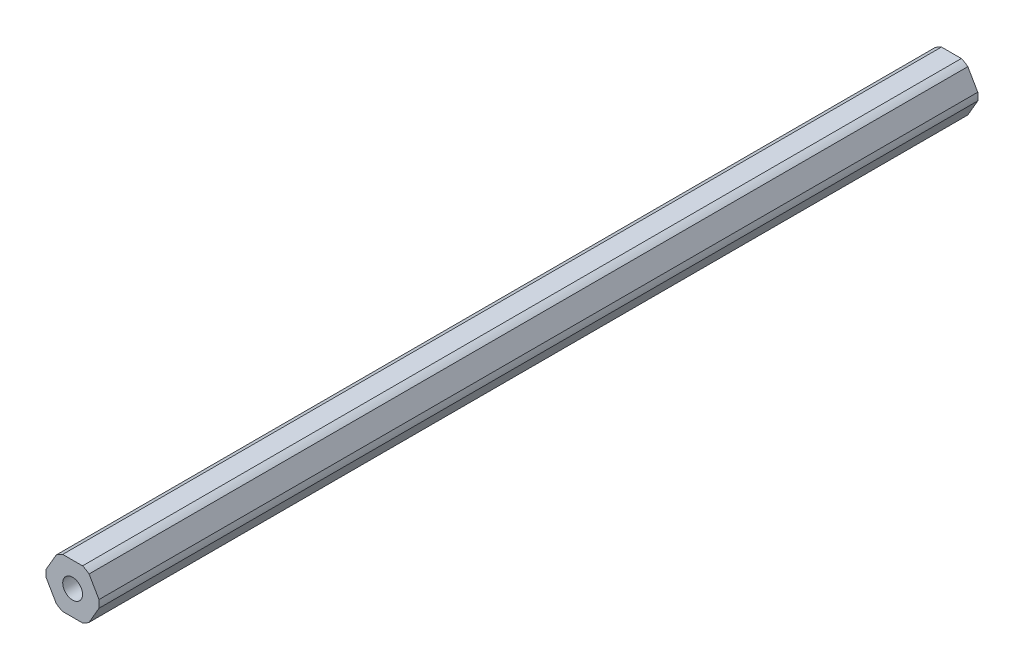
ISO-10303-21;
HEADER;
FILE_DESCRIPTION(('STEP AP214'),'2;1');
FILE_NAME('part.step','',(''),(''),'','','');
FILE_SCHEMA(('AUTOMOTIVE_DESIGN { 1 0 10303 214 1 1 1 1 }'));
ENDSEC;
DATA;
#1=APPLICATION_CONTEXT('core data for automotive mechanical design processes');
#2=APPLICATION_PROTOCOL_DEFINITION('international standard','automotive_design',2000,#1);
#3=PRODUCT_CONTEXT('',#1,'mechanical');
#4=PRODUCT('Part','Part','',(#3));
#5=PRODUCT_RELATED_PRODUCT_CATEGORY('part','',(#4));
#6=PRODUCT_DEFINITION_FORMATION('','',#4);
#7=PRODUCT_DEFINITION_CONTEXT('part definition',#1,'design');
#8=PRODUCT_DEFINITION('design','',#6,#7);
#9=PRODUCT_DEFINITION_SHAPE('','',#8);
#10=(LENGTH_UNIT() NAMED_UNIT(*) SI_UNIT(.MILLI.,.METRE.));
#11=(NAMED_UNIT(*) PLANE_ANGLE_UNIT() SI_UNIT($,.RADIAN.));
#12=(NAMED_UNIT(*) SI_UNIT($,.STERADIAN.) SOLID_ANGLE_UNIT());
#13=UNCERTAINTY_MEASURE_WITH_UNIT(LENGTH_MEASURE(1.E-05),#10,'distance_accuracy_value','');
#14=(GEOMETRIC_REPRESENTATION_CONTEXT(3) GLOBAL_UNCERTAINTY_ASSIGNED_CONTEXT((#13)) GLOBAL_UNIT_ASSIGNED_CONTEXT((#10,
#11,#12)) REPRESENTATION_CONTEXT('',''));
#15=CARTESIAN_POINT('',(0.,0.,0.));
#16=DIRECTION('',(0.,0.,1.));
#17=DIRECTION('',(1.,0.,0.));
#18=AXIS2_PLACEMENT_3D('',#15,#16,#17);
#19=CARTESIAN_POINT('',(0.,0.,-457.2));
#20=DIRECTION('',(0.,0.,1.));
#21=DIRECTION('',(1.,0.,0.));
#22=AXIS2_PLACEMENT_3D('',#19,#20,#21);
#23=CYLINDRICAL_SURFACE('',#22,6.87);
#24=CARTESIAN_POINT('',(0.,0.,230.63200000001));
#25=DIRECTION('',(0.,0.,1.));
#26=DIRECTION('',(1.,0.,0.));
#27=AXIS2_PLACEMENT_3D('',#24,#25,#26);
#28=CIRCLE('',#27,6.87);
#29=CARTESIAN_POINT('',(6.80102150534208,0.97108520937895,230.63200000001));
#30=VERTEX_POINT('',#29);
#31=CARTESIAN_POINT('',(6.80102150534208,-0.971085209378955,230.63200000001));
#32=VERTEX_POINT('',#31);
#33=EDGE_CURVE('E201',#30,#32,#28,.F.);
#34=ORIENTED_EDGE('',*,*,#33,.F.);
#35=DIRECTION('',(0.,0.,1.));
#36=VECTOR('',#35,1.);
#37=CARTESIAN_POINT('',(6.80102150534208,0.97108520937895,457.2));
#38=LINE('',#37,#36);
#39=CARTESIAN_POINT('',(6.80102150534208,0.971085209378948,457.2));
#40=VERTEX_POINT('',#39);
#41=EDGE_CURVE('E181',#30,#40,#38,.T.);
#42=ORIENTED_EDGE('',*,*,#41,.T.);
#43=CARTESIAN_POINT('',(0.,0.,457.2));
#44=DIRECTION('',(0.,0.,1.));
#45=DIRECTION('',(1.,0.,0.));
#46=AXIS2_PLACEMENT_3D('',#43,#44,#45);
#47=CIRCLE('',#46,6.87);
#48=CARTESIAN_POINT('',(6.80102150534208,-0.971085209378954,457.2));
#49=VERTEX_POINT('',#48);
#50=EDGE_CURVE('E230',#40,#49,#47,.F.);
#51=ORIENTED_EDGE('',*,*,#50,.T.);
#52=DIRECTION('',(0.,0.,1.));
#53=VECTOR('',#52,1.);
#54=CARTESIAN_POINT('',(6.80102150534208,-0.971085209378955,457.2));
#55=LINE('',#54,#53);
#56=EDGE_CURVE('E260',#49,#32,#55,.F.);
#57=ORIENTED_EDGE('',*,*,#56,.T.);
#58=EDGE_LOOP('',(#34,#42,#51,#57));
#59=FACE_BOUND('',#58,.T.);
#60=ADVANCED_FACE('F53',(#59),#23,.T.);
#61=CARTESIAN_POINT('',(3.68083890619154,6.3754,457.2));
#62=DIRECTION('',(0.,-1.,0.));
#63=DIRECTION('',(1.,0.,0.));
#64=AXIS2_PLACEMENT_3D('',#61,#62,#63);
#65=PLANE('',#64);
#66=DIRECTION('',(0.,0.,1.));
#67=VECTOR('',#66,1.);
#68=CARTESIAN_POINT('',(2.55952629210953,6.37540000000001,-457.2));
#69=LINE('',#68,#67);
#70=CARTESIAN_POINT('',(2.55952629210953,6.37540000000001,230.63200000001));
#71=VERTEX_POINT('',#70);
#72=CARTESIAN_POINT('',(2.55952629210953,6.37540000000001,457.2));
#73=VERTEX_POINT('',#72);
#74=EDGE_CURVE('E180',#71,#73,#69,.T.);
#75=ORIENTED_EDGE('',*,*,#74,.F.);
#76=DIRECTION('',(-1.,0.,0.));
#77=VECTOR('',#76,1.);
#78=CARTESIAN_POINT('',(3.68083890619154,6.3754,230.63200000001));
#79=LINE('',#78,#77);
#80=CARTESIAN_POINT('',(-2.55952629210953,6.37540000000001,230.63200000001));
#81=VERTEX_POINT('',#80);
#82=EDGE_CURVE('E73',#71,#81,#79,.T.);
#83=ORIENTED_EDGE('',*,*,#82,.T.);
#84=DIRECTION('',(0.,0.,1.));
#85=VECTOR('',#84,1.);
#86=CARTESIAN_POINT('',(-2.55952629210953,6.37540000000001,-457.2));
#87=LINE('',#86,#85);
#88=CARTESIAN_POINT('',(-2.55952629210953,6.37540000000001,457.2));
#89=VERTEX_POINT('',#88);
#90=EDGE_CURVE('E285',#89,#81,#87,.F.);
#91=ORIENTED_EDGE('',*,*,#90,.F.);
#92=DIRECTION('',(1.,0.,0.));
#93=VECTOR('',#92,1.);
#94=CARTESIAN_POINT('',(0.,6.3754,457.2));
#95=LINE('',#94,#93);
#96=EDGE_CURVE('E247',#73,#89,#95,.F.);
#97=ORIENTED_EDGE('',*,*,#96,.F.);
#98=EDGE_LOOP('',(#75,#83,#91,#97));
#99=FACE_BOUND('',#98,.T.);
#100=ADVANCED_FACE('F341',(#99),#65,.F.);
#101=CARTESIAN_POINT('',(0.,0.,-457.2));
#102=DIRECTION('',(0.,0.,1.));
#103=DIRECTION('',(1.,0.,0.));
#104=AXIS2_PLACEMENT_3D('',#101,#102,#103);
#105=CYLINDRICAL_SURFACE('',#104,6.87);
#106=CARTESIAN_POINT('',(0.,0.,230.63200000001));
#107=DIRECTION('',(0.,0.,1.));
#108=DIRECTION('',(1.,0.,0.));
#109=AXIS2_PLACEMENT_3D('',#106,#107,#108);
#110=CIRCLE('',#109,6.87);
#111=CARTESIAN_POINT('',(-4.24149521323255,5.40431479062104,230.63200000001));
#112=VERTEX_POINT('',#111);
#113=EDGE_CURVE('E81',#112,#81,#110,.F.);
#114=ORIENTED_EDGE('',*,*,#113,.F.);
#115=DIRECTION('',(0.,0.,1.));
#116=VECTOR('',#115,1.);
#117=CARTESIAN_POINT('',(-4.24149521323255,5.40431479062104,457.2));
#118=LINE('',#117,#116);
#119=CARTESIAN_POINT('',(-4.24149521323255,5.40431479062105,457.2));
#120=VERTEX_POINT('',#119);
#121=EDGE_CURVE('E282',#112,#120,#118,.T.);
#122=ORIENTED_EDGE('',*,*,#121,.T.);
#123=CARTESIAN_POINT('',(0.,0.,457.2));
#124=DIRECTION('',(0.,0.,1.));
#125=DIRECTION('',(1.,0.,0.));
#126=AXIS2_PLACEMENT_3D('',#123,#124,#125);
#127=CIRCLE('',#126,6.87);
#128=EDGE_CURVE('E246',#89,#120,#127,.T.);
#129=ORIENTED_EDGE('',*,*,#128,.F.);
#130=ORIENTED_EDGE('',*,*,#90,.T.);
#131=EDGE_LOOP('',(#114,#122,#129,#130));
#132=FACE_BOUND('',#131,.T.);
#133=ADVANCED_FACE('F339',(#132),#105,.T.);
#134=CARTESIAN_POINT('',(-3.68083890619154,6.3754,457.2));
#135=DIRECTION('',(0.866025403784439,-0.5,0.));
#136=DIRECTION('',(0.5,0.866025403784439,0.));
#137=AXIS2_PLACEMENT_3D('',#134,#135,#136);
#138=PLANE('',#137);
#139=ORIENTED_EDGE('',*,*,#121,.F.);
#140=DIRECTION('',(-0.5,-0.866025403784439,0.));
#141=VECTOR('',#140,1.);
#142=CARTESIAN_POINT('',(-3.68083890619154,6.3754,230.63200000001));
#143=LINE('',#142,#141);
#144=CARTESIAN_POINT('',(-6.80102150534208,0.971085209378959,230.63200000001));
#145=VERTEX_POINT('',#144);
#146=EDGE_CURVE('E225',#112,#145,#143,.T.);
#147=ORIENTED_EDGE('',*,*,#146,.T.);
#148=DIRECTION('',(0.,0.,1.));
#149=VECTOR('',#148,1.);
#150=CARTESIAN_POINT('',(-6.80102150534208,0.971085209378959,-457.2));
#151=LINE('',#150,#149);
#152=CARTESIAN_POINT('',(-6.80102150534208,0.971085209378961,457.2));
#153=VERTEX_POINT('',#152);
#154=EDGE_CURVE('E278',#153,#145,#151,.F.);
#155=ORIENTED_EDGE('',*,*,#154,.F.);
#156=DIRECTION('',(-0.5,-0.866025403784439,0.));
#157=VECTOR('',#156,1.);
#158=CARTESIAN_POINT('',(-4.24149521323255,5.40431479062104,457.2));
#159=LINE('',#158,#157);
#160=EDGE_CURVE('E243',#120,#153,#159,.T.);
#161=ORIENTED_EDGE('',*,*,#160,.F.);
#162=EDGE_LOOP('',(#139,#147,#155,#161));
#163=FACE_BOUND('',#162,.T.);
#164=ADVANCED_FACE('F337',(#163),#138,.F.);
#165=CARTESIAN_POINT('',(0.,0.,-457.2));
#166=DIRECTION('',(0.,0.,1.));
#167=DIRECTION('',(1.,0.,0.));
#168=AXIS2_PLACEMENT_3D('',#165,#166,#167);
#169=CYLINDRICAL_SURFACE('',#168,6.87);
#170=CARTESIAN_POINT('',(0.,0.,230.63200000001));
#171=DIRECTION('',(0.,0.,1.));
#172=DIRECTION('',(1.,0.,0.));
#173=AXIS2_PLACEMENT_3D('',#170,#171,#172);
#174=CIRCLE('',#173,6.87);
#175=CARTESIAN_POINT('',(-6.80102150534208,-0.971085209378956,230.63200000001));
#176=VERTEX_POINT('',#175);
#177=EDGE_CURVE('E221',#176,#145,#174,.F.);
#178=ORIENTED_EDGE('',*,*,#177,.F.);
#179=DIRECTION('',(0.,0.,1.));
#180=VECTOR('',#179,1.);
#181=CARTESIAN_POINT('',(-6.80102150534208,-0.971085209378956,457.2));
#182=LINE('',#181,#180);
#183=CARTESIAN_POINT('',(-6.80102150534208,-0.971085209378955,457.2));
#184=VERTEX_POINT('',#183);
#185=EDGE_CURVE('E275',#176,#184,#182,.T.);
#186=ORIENTED_EDGE('',*,*,#185,.T.);
#187=CARTESIAN_POINT('',(0.,0.,457.2));
#188=DIRECTION('',(0.,0.,1.));
#189=DIRECTION('',(1.,0.,0.));
#190=AXIS2_PLACEMENT_3D('',#187,#188,#189);
#191=CIRCLE('',#190,6.87);
#192=EDGE_CURVE('E242',#153,#184,#191,.T.);
#193=ORIENTED_EDGE('',*,*,#192,.F.);
#194=ORIENTED_EDGE('',*,*,#154,.T.);
#195=EDGE_LOOP('',(#178,#186,#193,#194));
#196=FACE_BOUND('',#195,.T.);
#197=ADVANCED_FACE('F333',(#196),#169,.T.);
#198=CARTESIAN_POINT('',(-7.36167781238308,0.,457.2));
#199=DIRECTION('',(0.866025403784439,0.5,0.));
#200=DIRECTION('',(-0.5,0.866025403784439,0.));
#201=AXIS2_PLACEMENT_3D('',#198,#199,#200);
#202=PLANE('',#201);
#203=ORIENTED_EDGE('',*,*,#185,.F.);
#204=DIRECTION('',(0.5,-0.866025403784439,0.));
#205=VECTOR('',#204,1.);
#206=CARTESIAN_POINT('',(-7.36167781238308,0.,230.63200000001));
#207=LINE('',#206,#205);
#208=CARTESIAN_POINT('',(-4.24149521323255,-5.40431479062105,230.63200000001));
#209=VERTEX_POINT('',#208);
#210=EDGE_CURVE('E218',#176,#209,#207,.T.);
#211=ORIENTED_EDGE('',*,*,#210,.T.);
#212=DIRECTION('',(0.,0.,1.));
#213=VECTOR('',#212,1.);
#214=CARTESIAN_POINT('',(-4.24149521323255,-5.40431479062105,-457.2));
#215=LINE('',#214,#213);
#216=CARTESIAN_POINT('',(-4.24149521323255,-5.40431479062105,457.2));
#217=VERTEX_POINT('',#216);
#218=EDGE_CURVE('E271',#217,#209,#215,.F.);
#219=ORIENTED_EDGE('',*,*,#218,.F.);
#220=DIRECTION('',(0.5,-0.866025403784439,0.));
#221=VECTOR('',#220,1.);
#222=CARTESIAN_POINT('',(-6.80102150534208,-0.971085209378956,457.2));
#223=LINE('',#222,#221);
#224=EDGE_CURVE('E239',#184,#217,#223,.T.);
#225=ORIENTED_EDGE('',*,*,#224,.F.);
#226=EDGE_LOOP('',(#203,#211,#219,#225));
#227=FACE_BOUND('',#226,.T.);
#228=ADVANCED_FACE('F331',(#227),#202,.F.);
#229=CARTESIAN_POINT('',(0.,0.,-457.2));
#230=DIRECTION('',(0.,0.,1.));
#231=DIRECTION('',(1.,0.,0.));
#232=AXIS2_PLACEMENT_3D('',#229,#230,#231);
#233=CYLINDRICAL_SURFACE('',#232,6.87);
#234=CARTESIAN_POINT('',(0.,0.,230.63200000001));
#235=DIRECTION('',(0.,0.,1.));
#236=DIRECTION('',(1.,0.,0.));
#237=AXIS2_PLACEMENT_3D('',#234,#235,#236);
#238=CIRCLE('',#237,6.87);
#239=CARTESIAN_POINT('',(-2.55952629210953,-6.3754,230.63200000001));
#240=VERTEX_POINT('',#239);
#241=EDGE_CURVE('E214',#240,#209,#238,.F.);
#242=ORIENTED_EDGE('',*,*,#241,.F.);
#243=DIRECTION('',(0.,0.,1.));
#244=VECTOR('',#243,1.);
#245=CARTESIAN_POINT('',(-2.55952629210953,-6.3754,457.2));
#246=LINE('',#245,#244);
#247=CARTESIAN_POINT('',(-2.55952629210953,-6.3754,457.2));
#248=VERTEX_POINT('',#247);
#249=EDGE_CURVE('E268',#240,#248,#246,.T.);
#250=ORIENTED_EDGE('',*,*,#249,.T.);
#251=CARTESIAN_POINT('',(0.,0.,457.2));
#252=DIRECTION('',(0.,0.,1.));
#253=DIRECTION('',(1.,0.,0.));
#254=AXIS2_PLACEMENT_3D('',#251,#252,#253);
#255=CIRCLE('',#254,6.87);
#256=EDGE_CURVE('E238',#217,#248,#255,.T.);
#257=ORIENTED_EDGE('',*,*,#256,.F.);
#258=ORIENTED_EDGE('',*,*,#218,.T.);
#259=EDGE_LOOP('',(#242,#250,#257,#258));
#260=FACE_BOUND('',#259,.T.);
#261=ADVANCED_FACE('F325',(#260),#233,.T.);
#262=CARTESIAN_POINT('',(-3.68083890619154,-6.3754,457.2));
#263=DIRECTION('',(0.,1.,0.));
#264=DIRECTION('',(0.,0.,1.));
#265=AXIS2_PLACEMENT_3D('',#262,#263,#264);
#266=PLANE('',#265);
#267=ORIENTED_EDGE('',*,*,#249,.F.);
#268=DIRECTION('',(1.,0.,0.));
#269=VECTOR('',#268,1.);
#270=CARTESIAN_POINT('',(-3.68083890619154,-6.3754,230.63200000001));
#271=LINE('',#270,#269);
#272=CARTESIAN_POINT('',(2.55952629210953,-6.3754,230.63200000001));
#273=VERTEX_POINT('',#272);
#274=EDGE_CURVE('E211',#240,#273,#271,.T.);
#275=ORIENTED_EDGE('',*,*,#274,.T.);
#276=DIRECTION('',(0.,0.,1.));
#277=VECTOR('',#276,1.);
#278=CARTESIAN_POINT('',(2.55952629210953,-6.3754,-457.2));
#279=LINE('',#278,#277);
#280=CARTESIAN_POINT('',(2.55952629210953,-6.3754,457.2));
#281=VERTEX_POINT('',#280);
#282=EDGE_CURVE('E264',#281,#273,#279,.F.);
#283=ORIENTED_EDGE('',*,*,#282,.F.);
#284=DIRECTION('',(1.,0.,0.));
#285=VECTOR('',#284,1.);
#286=CARTESIAN_POINT('',(0.,-6.3754,457.2));
#287=LINE('',#286,#285);
#288=EDGE_CURVE('E235',#248,#281,#287,.T.);
#289=ORIENTED_EDGE('',*,*,#288,.F.);
#290=EDGE_LOOP('',(#267,#275,#283,#289));
#291=FACE_BOUND('',#290,.T.);
#292=ADVANCED_FACE('F322',(#291),#266,.F.);
#293=CARTESIAN_POINT('',(0.,0.,-457.2));
#294=DIRECTION('',(0.,0.,1.));
#295=DIRECTION('',(1.,0.,0.));
#296=AXIS2_PLACEMENT_3D('',#293,#294,#295);
#297=CYLINDRICAL_SURFACE('',#296,6.87);
#298=CARTESIAN_POINT('',(0.,0.,230.63200000001));
#299=DIRECTION('',(0.,0.,1.));
#300=DIRECTION('',(1.,0.,0.));
#301=AXIS2_PLACEMENT_3D('',#298,#299,#300);
#302=CIRCLE('',#301,6.87);
#303=CARTESIAN_POINT('',(4.24149521323254,-5.40431479062105,230.63200000001));
#304=VERTEX_POINT('',#303);
#305=EDGE_CURVE('E207',#304,#273,#302,.F.);
#306=ORIENTED_EDGE('',*,*,#305,.F.);
#307=DIRECTION('',(0.,0.,1.));
#308=VECTOR('',#307,1.);
#309=CARTESIAN_POINT('',(4.24149521323254,-5.40431479062105,457.2));
#310=LINE('',#309,#308);
#311=CARTESIAN_POINT('',(4.24149521323254,-5.40431479062105,457.2));
#312=VERTEX_POINT('',#311);
#313=EDGE_CURVE('E257',#304,#312,#310,.T.);
#314=ORIENTED_EDGE('',*,*,#313,.T.);
#315=CARTESIAN_POINT('',(0.,0.,457.2));
#316=DIRECTION('',(0.,0.,1.));
#317=DIRECTION('',(1.,0.,0.));
#318=AXIS2_PLACEMENT_3D('',#315,#316,#317);
#319=CIRCLE('',#318,6.87);
#320=EDGE_CURVE('E234',#281,#312,#319,.T.);
#321=ORIENTED_EDGE('',*,*,#320,.F.);
#322=ORIENTED_EDGE('',*,*,#282,.T.);
#323=EDGE_LOOP('',(#306,#314,#321,#322));
#324=FACE_BOUND('',#323,.T.);
#325=ADVANCED_FACE('F317',(#324),#297,.T.);
#326=CARTESIAN_POINT('',(3.68083890619154,-6.3754,457.2));
#327=DIRECTION('',(-0.866025403784439,0.5,0.));
#328=DIRECTION('',(-0.5,-0.866025403784439,0.));
#329=AXIS2_PLACEMENT_3D('',#326,#327,#328);
#330=PLANE('',#329);
#331=ORIENTED_EDGE('',*,*,#313,.F.);
#332=DIRECTION('',(0.5,0.866025403784439,0.));
#333=VECTOR('',#332,1.);
#334=CARTESIAN_POINT('',(3.68083890619154,-6.3754,230.63200000001));
#335=LINE('',#334,#333);
#336=EDGE_CURVE('E204',#304,#32,#335,.T.);
#337=ORIENTED_EDGE('',*,*,#336,.T.);
#338=ORIENTED_EDGE('',*,*,#56,.F.);
#339=DIRECTION('',(0.5,0.866025403784439,0.));
#340=VECTOR('',#339,1.);
#341=CARTESIAN_POINT('',(4.24149521323254,-5.40431479062105,457.2));
#342=LINE('',#341,#340);
#343=EDGE_CURVE('E62',#312,#49,#342,.T.);
#344=ORIENTED_EDGE('',*,*,#343,.F.);
#345=EDGE_LOOP('',(#331,#337,#338,#344));
#346=FACE_BOUND('',#345,.T.);
#347=ADVANCED_FACE('F309',(#346),#330,.F.);
#348=CARTESIAN_POINT('',(7.36167781238308,0.,457.2));
#349=DIRECTION('',(-0.866025403784439,-0.5,0.));
#350=DIRECTION('',(0.5,-0.866025403784439,0.));
#351=AXIS2_PLACEMENT_3D('',#348,#349,#350);
#352=PLANE('',#351);
#353=ORIENTED_EDGE('',*,*,#41,.F.);
#354=DIRECTION('',(-0.5,0.866025403784439,0.));
#355=VECTOR('',#354,1.);
#356=CARTESIAN_POINT('',(7.36167781238308,0.,230.63200000001));
#357=LINE('',#356,#355);
#358=CARTESIAN_POINT('',(4.24149521323254,5.40431479062105,230.63200000001));
#359=VERTEX_POINT('',#358);
#360=EDGE_CURVE('E185',#30,#359,#357,.T.);
#361=ORIENTED_EDGE('',*,*,#360,.T.);
#362=DIRECTION('',(0.,0.,1.));
#363=VECTOR('',#362,1.);
#364=CARTESIAN_POINT('',(4.24149521323254,5.40431479062105,-457.2));
#365=LINE('',#364,#363);
#366=CARTESIAN_POINT('',(4.24149521323254,5.40431479062105,457.2));
#367=VERTEX_POINT('',#366);
#368=EDGE_CURVE('E170',#367,#359,#365,.F.);
#369=ORIENTED_EDGE('',*,*,#368,.F.);
#370=DIRECTION('',(-0.5,0.866025403784438,0.));
#371=VECTOR('',#370,1.);
#372=CARTESIAN_POINT('',(6.80102150534208,0.97108520937895,457.2));
#373=LINE('',#372,#371);
#374=EDGE_CURVE('E250',#40,#367,#373,.T.);
#375=ORIENTED_EDGE('',*,*,#374,.F.);
#376=EDGE_LOOP('',(#353,#361,#369,#375));
#377=FACE_BOUND('',#376,.T.);
#378=ADVANCED_FACE('F186',(#377),#352,.F.);
#379=CARTESIAN_POINT('',(0.,0.,-457.2));
#380=DIRECTION('',(0.,0.,1.));
#381=DIRECTION('',(1.,0.,0.));
#382=AXIS2_PLACEMENT_3D('',#379,#380,#381);
#383=CYLINDRICAL_SURFACE('',#382,6.87);
#384=CARTESIAN_POINT('',(0.,0.,230.63200000001));
#385=DIRECTION('',(0.,0.,1.));
#386=DIRECTION('',(1.,0.,0.));
#387=AXIS2_PLACEMENT_3D('',#384,#385,#386);
#388=CIRCLE('',#387,6.87);
#389=EDGE_CURVE('E174',#71,#359,#388,.F.);
#390=ORIENTED_EDGE('',*,*,#389,.F.);
#391=ORIENTED_EDGE('',*,*,#74,.T.);
#392=CARTESIAN_POINT('',(0.,0.,457.2));
#393=DIRECTION('',(0.,0.,1.));
#394=DIRECTION('',(1.,0.,0.));
#395=AXIS2_PLACEMENT_3D('',#392,#393,#394);
#396=CIRCLE('',#395,6.87);
#397=EDGE_CURVE('E176',#367,#73,#396,.T.);
#398=ORIENTED_EDGE('',*,*,#397,.F.);
#399=ORIENTED_EDGE('',*,*,#368,.T.);
#400=EDGE_LOOP('',(#390,#391,#398,#399));
#401=FACE_BOUND('',#400,.T.);
#402=ADVANCED_FACE('F172',(#401),#383,.T.);
#403=CARTESIAN_POINT('',(0.,0.,457.2));
#404=DIRECTION('',(0.,0.,1.));
#405=DIRECTION('',(1.,0.,0.));
#406=AXIS2_PLACEMENT_3D('',#403,#404,#405);
#407=PLANE('',#406);
#408=ORIENTED_EDGE('',*,*,#343,.T.);
#409=ORIENTED_EDGE('',*,*,#50,.F.);
#410=ORIENTED_EDGE('',*,*,#374,.T.);
#411=ORIENTED_EDGE('',*,*,#397,.T.);
#412=ORIENTED_EDGE('',*,*,#96,.T.);
#413=ORIENTED_EDGE('',*,*,#128,.T.);
#414=ORIENTED_EDGE('',*,*,#160,.T.);
#415=ORIENTED_EDGE('',*,*,#192,.T.);
#416=ORIENTED_EDGE('',*,*,#224,.T.);
#417=ORIENTED_EDGE('',*,*,#256,.T.);
#418=ORIENTED_EDGE('',*,*,#288,.T.);
#419=ORIENTED_EDGE('',*,*,#320,.T.);
#420=EDGE_LOOP('',(#408,#409,#410,#411,#412,#413,#414,#415,#416,#417,#418,#419));
#421=FACE_BOUND('',#420,.T.);
#422=CARTESIAN_POINT('',(0.,0.,457.2));
#423=DIRECTION('',(0.,0.,1.));
#424=DIRECTION('',(1.,0.,0.));
#425=AXIS2_PLACEMENT_3D('',#422,#423,#424);
#426=CIRCLE('',#425,2.55);
#427=CARTESIAN_POINT('',(2.55,0.,457.2));
#428=VERTEX_POINT('',#427);
#429=EDGE_CURVE('E14',#428,#428,#426,.F.);
#430=ORIENTED_EDGE('',*,*,#429,.T.);
#431=EDGE_LOOP('',(#430));
#432=FACE_BOUND('',#431,.T.);
#433=ADVANCED_FACE('F311',(#421,#432),#407,.T.);
#434=CARTESIAN_POINT('',(0.,0.,-457.2));
#435=DIRECTION('',(0.,0.,1.));
#436=DIRECTION('',(1.,0.,0.));
#437=AXIS2_PLACEMENT_3D('',#434,#435,#436);
#438=CYLINDRICAL_SURFACE('',#437,2.55);
#439=CARTESIAN_POINT('',(0.,0.,230.63200000001));
#440=DIRECTION('',(0.,0.,1.));
#441=DIRECTION('',(1.,0.,0.));
#442=AXIS2_PLACEMENT_3D('',#439,#440,#441);
#443=CIRCLE('',#442,2.55);
#444=CARTESIAN_POINT('',(2.55,0.,230.63200000001));
#445=VERTEX_POINT('',#444);
#446=EDGE_CURVE('E56',#445,#445,#443,.F.);
#447=ORIENTED_EDGE('',*,*,#446,.T.);
#448=EDGE_LOOP('',(#447));
#449=FACE_BOUND('',#448,.T.);
#450=ORIENTED_EDGE('',*,*,#429,.F.);
#451=EDGE_LOOP('',(#450));
#452=FACE_BOUND('',#451,.T.);
#453=ADVANCED_FACE('F348',(#449,#452),#438,.F.);
#454=CARTESIAN_POINT('',(6.18849884859204E-13,1.42585428750122E-13,230.63200000001));
#455=DIRECTION('',(0.,0.,1.));
#456=DIRECTION('',(1.,0.,0.));
#457=AXIS2_PLACEMENT_3D('',#454,#455,#456);
#458=PLANE('',#457);
#459=ORIENTED_EDGE('',*,*,#146,.F.);
#460=ORIENTED_EDGE('',*,*,#113,.T.);
#461=ORIENTED_EDGE('',*,*,#82,.F.);
#462=ORIENTED_EDGE('',*,*,#389,.T.);
#463=ORIENTED_EDGE('',*,*,#360,.F.);
#464=ORIENTED_EDGE('',*,*,#33,.T.);
#465=ORIENTED_EDGE('',*,*,#336,.F.);
#466=ORIENTED_EDGE('',*,*,#305,.T.);
#467=ORIENTED_EDGE('',*,*,#274,.F.);
#468=ORIENTED_EDGE('',*,*,#241,.T.);
#469=ORIENTED_EDGE('',*,*,#210,.F.);
#470=ORIENTED_EDGE('',*,*,#177,.T.);
#471=EDGE_LOOP('',(#459,#460,#461,#462,#463,#464,#465,#466,#467,#468,#469,#470));
#472=FACE_BOUND('',#471,.T.);
#473=ORIENTED_EDGE('',*,*,#446,.F.);
#474=EDGE_LOOP('',(#473));
#475=FACE_BOUND('',#474,.T.);
#476=ADVANCED_FACE('F192',(#472,#475),#458,.F.);
#477=CLOSED_SHELL('',(#60,#100,#133,#164,#197,#228,#261,#292,#325,#347,#378,#402,#433,#453,#476));
#478=MANIFOLD_SOLID_BREP('B2',#477);
#479=ADVANCED_BREP_SHAPE_REPRESENTATION('',(#18,#478),#14);
#480=SHAPE_DEFINITION_REPRESENTATION(#9,#479);
ENDSEC;
END-ISO-10303-21;
